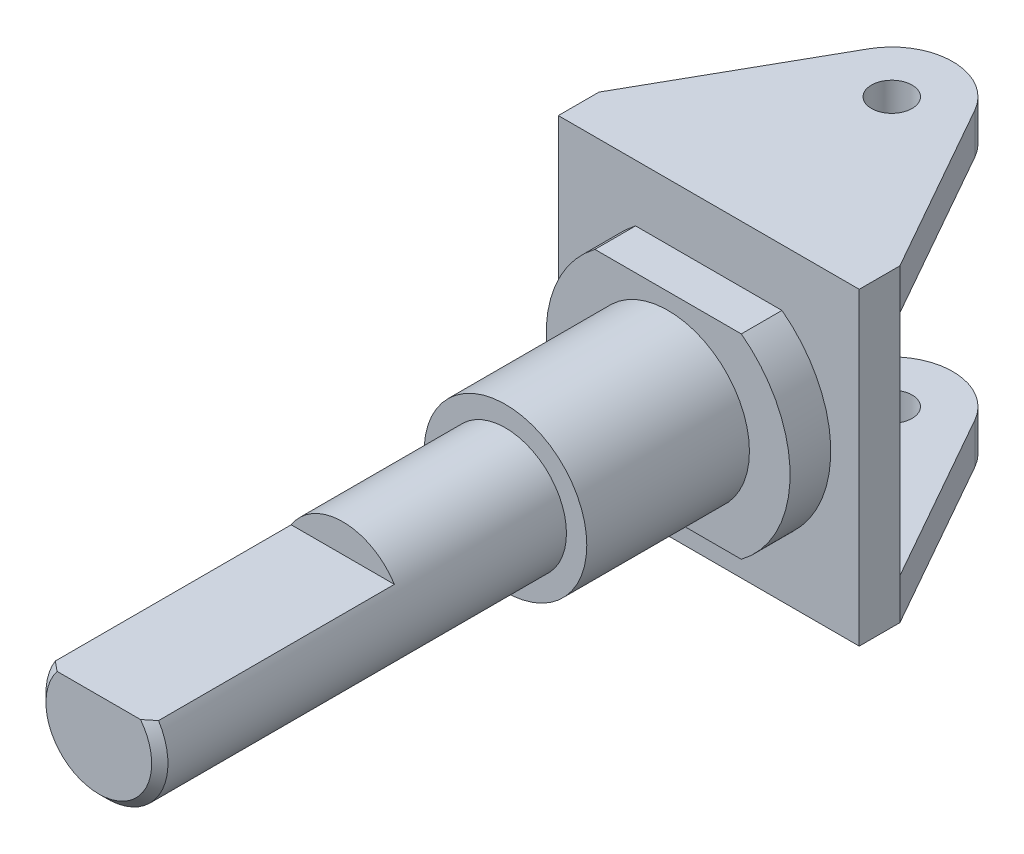
ISO-10303-21;
HEADER;
FILE_DESCRIPTION(('STEP AP214'),'2;1');
FILE_NAME('part.step','',(''),(''),'','','');
FILE_SCHEMA(('AUTOMOTIVE_DESIGN { 1 0 10303 214 1 1 1 1 }'));
ENDSEC;
DATA;
#1=APPLICATION_CONTEXT('core data for automotive mechanical design processes');
#2=APPLICATION_PROTOCOL_DEFINITION('international standard','automotive_design',2000,#1);
#3=PRODUCT_CONTEXT('',#1,'mechanical');
#4=PRODUCT('Part','Part','',(#3));
#5=PRODUCT_RELATED_PRODUCT_CATEGORY('part','',(#4));
#6=PRODUCT_DEFINITION_FORMATION('','',#4);
#7=PRODUCT_DEFINITION_CONTEXT('part definition',#1,'design');
#8=PRODUCT_DEFINITION('design','',#6,#7);
#9=PRODUCT_DEFINITION_SHAPE('','',#8);
#10=(LENGTH_UNIT() NAMED_UNIT(*) SI_UNIT(.MILLI.,.METRE.));
#11=(NAMED_UNIT(*) PLANE_ANGLE_UNIT() SI_UNIT($,.RADIAN.));
#12=(NAMED_UNIT(*) SI_UNIT($,.STERADIAN.) SOLID_ANGLE_UNIT());
#13=UNCERTAINTY_MEASURE_WITH_UNIT(LENGTH_MEASURE(1.E-05),#10,'distance_accuracy_value','');
#14=(GEOMETRIC_REPRESENTATION_CONTEXT(3) GLOBAL_UNCERTAINTY_ASSIGNED_CONTEXT((#13)) GLOBAL_UNIT_ASSIGNED_CONTEXT((#10,
#11,#12)) REPRESENTATION_CONTEXT('',''));
#15=CARTESIAN_POINT('',(0.,0.,0.));
#16=DIRECTION('',(0.,0.,1.));
#17=DIRECTION('',(1.,0.,0.));
#18=AXIS2_PLACEMENT_3D('',#15,#16,#17);
#19=CARTESIAN_POINT('',(0.,-38.,-45.));
#20=DIRECTION('',(0.,1.,0.));
#21=DIRECTION('',(0.,0.,1.));
#22=AXIS2_PLACEMENT_3D('',#19,#20,#21);
#23=PLANE('',#22);
#24=DIRECTION('',(0.,0.,-1.));
#25=VECTOR('',#24,1.);
#26=CARTESIAN_POINT('',(-37.,-38.,-10.));
#27=LINE('',#26,#25);
#28=CARTESIAN_POINT('',(-37.,-38.,0.));
#29=VERTEX_POINT('',#28);
#30=CARTESIAN_POINT('',(-37.,-38.,-10.));
#31=VERTEX_POINT('',#30);
#32=EDGE_CURVE('E252',#29,#31,#27,.T.);
#33=ORIENTED_EDGE('',*,*,#32,.T.);
#34=DIRECTION('',(0.491857302042566,0.,-0.870675826256482));
#35=VECTOR('',#34,1.);
#36=CARTESIAN_POINT('',(-13.0601373938472,-38.,-52.3778595306385));
#37=LINE('',#36,#35);
#38=CARTESIAN_POINT('',(-13.0601373938472,-38.,-52.3778595306385));
#39=VERTEX_POINT('',#38);
#40=EDGE_CURVE('E255',#31,#39,#37,.T.);
#41=ORIENTED_EDGE('',*,*,#40,.T.);
#42=CARTESIAN_POINT('',(0.,-38.,-45.));
#43=DIRECTION('',(0.,-1.,0.));
#44=DIRECTION('',(0.,0.,1.));
#45=AXIS2_PLACEMENT_3D('',#42,#43,#44);
#46=CIRCLE('',#45,15.);
#47=CARTESIAN_POINT('',(13.0601373938472,-38.,-52.3778595306385));
#48=VERTEX_POINT('',#47);
#49=EDGE_CURVE('E258',#39,#48,#46,.T.);
#50=ORIENTED_EDGE('',*,*,#49,.T.);
#51=DIRECTION('',(0.491857302042566,0.,0.870675826256482));
#52=VECTOR('',#51,1.);
#53=CARTESIAN_POINT('',(37.,-38.,-10.));
#54=LINE('',#53,#52);
#55=CARTESIAN_POINT('',(37.,-38.,-10.));
#56=VERTEX_POINT('',#55);
#57=EDGE_CURVE('E260',#48,#56,#54,.T.);
#58=ORIENTED_EDGE('',*,*,#57,.T.);
#59=DIRECTION('',(0.,0.,1.));
#60=VECTOR('',#59,1.);
#61=CARTESIAN_POINT('',(37.,-38.,0.));
#62=LINE('',#61,#60);
#63=CARTESIAN_POINT('',(37.,-38.,0.));
#64=VERTEX_POINT('',#63);
#65=EDGE_CURVE('E262',#56,#64,#62,.T.);
#66=ORIENTED_EDGE('',*,*,#65,.T.);
#67=DIRECTION('',(-1.,0.,0.));
#68=VECTOR('',#67,1.);
#69=CARTESIAN_POINT('',(-37.,-38.,0.));
#70=LINE('',#69,#68);
#71=EDGE_CURVE('E265',#64,#29,#70,.T.);
#72=ORIENTED_EDGE('',*,*,#71,.T.);
#73=EDGE_LOOP('',(#33,#41,#50,#58,#66,#72));
#74=FACE_BOUND('',#73,.T.);
#75=CARTESIAN_POINT('',(0.,-38.,-45.));
#76=DIRECTION('',(0.,-1.,0.));
#77=DIRECTION('',(0.,0.,-1.));
#78=AXIS2_PLACEMENT_3D('',#75,#76,#77);
#79=CIRCLE('',#78,4.99999999999999);
#80=CARTESIAN_POINT('',(0.,-38.,-50.));
#81=VERTEX_POINT('',#80);
#82=EDGE_CURVE('E438',#81,#81,#79,.T.);
#83=ORIENTED_EDGE('',*,*,#82,.F.);
#84=EDGE_LOOP('',(#83));
#85=FACE_BOUND('',#84,.T.);
#86=ADVANCED_FACE('F37',(#74,#85),#23,.F.);
#87=CARTESIAN_POINT('',(37.,-28.,-10.));
#88=DIRECTION('',(1.,0.,0.));
#89=DIRECTION('',(0.,0.,-1.));
#90=AXIS2_PLACEMENT_3D('',#87,#88,#89);
#91=PLANE('',#90);
#92=DIRECTION('',(0.,1.,0.));
#93=VECTOR('',#92,1.);
#94=CARTESIAN_POINT('',(37.,-28.,0.));
#95=LINE('',#94,#93);
#96=CARTESIAN_POINT('',(37.,38.,0.));
#97=VERTEX_POINT('',#96);
#98=EDGE_CURVE('E290',#64,#97,#95,.T.);
#99=ORIENTED_EDGE('',*,*,#98,.F.);
#100=ORIENTED_EDGE('',*,*,#65,.F.);
#101=DIRECTION('',(0.,1.,0.));
#102=VECTOR('',#101,1.);
#103=CARTESIAN_POINT('',(37.,-38.,-10.));
#104=LINE('',#103,#102);
#105=CARTESIAN_POINT('',(37.,-28.,-10.));
#106=VERTEX_POINT('',#105);
#107=EDGE_CURVE('E268',#56,#106,#104,.T.);
#108=ORIENTED_EDGE('',*,*,#107,.T.);
#109=DIRECTION('',(0.,1.,0.));
#110=VECTOR('',#109,1.);
#111=CARTESIAN_POINT('',(37.,-28.,-10.));
#112=LINE('',#111,#110);
#113=CARTESIAN_POINT('',(37.,28.,-10.));
#114=VERTEX_POINT('',#113);
#115=EDGE_CURVE('E184',#106,#114,#112,.T.);
#116=ORIENTED_EDGE('',*,*,#115,.T.);
#117=DIRECTION('',(0.,-1.,0.));
#118=VECTOR('',#117,1.);
#119=CARTESIAN_POINT('',(37.,38.,-10.));
#120=LINE('',#119,#118);
#121=CARTESIAN_POINT('',(37.,38.,-10.));
#122=VERTEX_POINT('',#121);
#123=EDGE_CURVE('E248',#122,#114,#120,.T.);
#124=ORIENTED_EDGE('',*,*,#123,.F.);
#125=DIRECTION('',(0.,0.,-1.));
#126=VECTOR('',#125,1.);
#127=CARTESIAN_POINT('',(37.,38.,-10.));
#128=LINE('',#127,#126);
#129=EDGE_CURVE('E218',#97,#122,#128,.T.);
#130=ORIENTED_EDGE('',*,*,#129,.F.);
#131=EDGE_LOOP('',(#99,#100,#108,#116,#124,#130));
#132=FACE_BOUND('',#131,.T.);
#133=ADVANCED_FACE('F375',(#132),#91,.T.);
#134=CARTESIAN_POINT('',(-37.,28.,-10.));
#135=DIRECTION('',(-1.,0.,0.));
#136=DIRECTION('',(0.,0.,1.));
#137=AXIS2_PLACEMENT_3D('',#134,#135,#136);
#138=PLANE('',#137);
#139=DIRECTION('',(0.,-1.,0.));
#140=VECTOR('',#139,1.);
#141=CARTESIAN_POINT('',(-37.,28.,0.));
#142=LINE('',#141,#140);
#143=CARTESIAN_POINT('',(-37.,38.,0.));
#144=VERTEX_POINT('',#143);
#145=EDGE_CURVE('E285',#144,#29,#142,.T.);
#146=ORIENTED_EDGE('',*,*,#145,.F.);
#147=DIRECTION('',(0.,0.,1.));
#148=VECTOR('',#147,1.);
#149=CARTESIAN_POINT('',(-37.,38.,0.));
#150=LINE('',#149,#148);
#151=CARTESIAN_POINT('',(-37.,38.,-10.));
#152=VERTEX_POINT('',#151);
#153=EDGE_CURVE('E228',#152,#144,#150,.T.);
#154=ORIENTED_EDGE('',*,*,#153,.F.);
#155=DIRECTION('',(0.,-1.,0.));
#156=VECTOR('',#155,1.);
#157=CARTESIAN_POINT('',(-37.,38.,-10.));
#158=LINE('',#157,#156);
#159=CARTESIAN_POINT('',(-37.,28.,-10.));
#160=VERTEX_POINT('',#159);
#161=EDGE_CURVE('E234',#152,#160,#158,.T.);
#162=ORIENTED_EDGE('',*,*,#161,.T.);
#163=DIRECTION('',(0.,-1.,0.));
#164=VECTOR('',#163,1.);
#165=CARTESIAN_POINT('',(-37.,28.,-10.));
#166=LINE('',#165,#164);
#167=CARTESIAN_POINT('',(-37.,-28.,-10.));
#168=VERTEX_POINT('',#167);
#169=EDGE_CURVE('E289',#160,#168,#166,.T.);
#170=ORIENTED_EDGE('',*,*,#169,.T.);
#171=DIRECTION('',(0.,1.,0.));
#172=VECTOR('',#171,1.);
#173=CARTESIAN_POINT('',(-37.,-38.,-10.));
#174=LINE('',#173,#172);
#175=EDGE_CURVE('E282',#31,#168,#174,.T.);
#176=ORIENTED_EDGE('',*,*,#175,.F.);
#177=ORIENTED_EDGE('',*,*,#32,.F.);
#178=EDGE_LOOP('',(#146,#154,#162,#170,#176,#177));
#179=FACE_BOUND('',#178,.T.);
#180=ADVANCED_FACE('F396',(#179),#138,.T.);
#181=CARTESIAN_POINT('',(0.,0.,-10.));
#182=DIRECTION('',(0.,0.,1.));
#183=DIRECTION('',(1.,0.,0.));
#184=AXIS2_PLACEMENT_3D('',#181,#182,#183);
#185=PLANE('',#184);
#186=DIRECTION('',(-1.,0.,0.));
#187=VECTOR('',#186,1.);
#188=CARTESIAN_POINT('',(37.,28.,-10.));
#189=LINE('',#188,#187);
#190=EDGE_CURVE('E286',#114,#160,#189,.T.);
#191=ORIENTED_EDGE('',*,*,#190,.F.);
#192=ORIENTED_EDGE('',*,*,#115,.F.);
#193=DIRECTION('',(1.,0.,0.));
#194=VECTOR('',#193,1.);
#195=CARTESIAN_POINT('',(-37.,-28.,-10.));
#196=LINE('',#195,#194);
#197=EDGE_CURVE('E293',#168,#106,#196,.T.);
#198=ORIENTED_EDGE('',*,*,#197,.F.);
#199=ORIENTED_EDGE('',*,*,#169,.F.);
#200=EDGE_LOOP('',(#191,#192,#198,#199));
#201=FACE_BOUND('',#200,.T.);
#202=ADVANCED_FACE('F393',(#201),#185,.F.);
#203=CARTESIAN_POINT('',(0.,0.,0.));
#204=DIRECTION('',(0.,0.,1.));
#205=DIRECTION('',(1.,0.,0.));
#206=AXIS2_PLACEMENT_3D('',#203,#204,#205);
#207=PLANE('',#206);
#208=CARTESIAN_POINT('',(0.,0.,0.));
#209=DIRECTION('',(0.,0.,1.));
#210=DIRECTION('',(-1.,0.,0.));
#211=AXIS2_PLACEMENT_3D('',#208,#209,#210);
#212=CIRCLE('',#211,30.);
#213=CARTESIAN_POINT('',(18.,-24.,0.));
#214=VERTEX_POINT('',#213);
#215=CARTESIAN_POINT('',(18.,24.,0.));
#216=VERTEX_POINT('',#215);
#217=EDGE_CURVE('E181',#214,#216,#212,.T.);
#218=ORIENTED_EDGE('',*,*,#217,.F.);
#219=DIRECTION('',(1.,0.,0.));
#220=VECTOR('',#219,1.);
#221=CARTESIAN_POINT('',(18.,-24.,0.));
#222=LINE('',#221,#220);
#223=CARTESIAN_POINT('',(-18.,-24.,0.));
#224=VERTEX_POINT('',#223);
#225=EDGE_CURVE('E189',#224,#214,#222,.T.);
#226=ORIENTED_EDGE('',*,*,#225,.F.);
#227=CARTESIAN_POINT('',(0.,0.,0.));
#228=DIRECTION('',(0.,0.,1.));
#229=DIRECTION('',(-1.,0.,0.));
#230=AXIS2_PLACEMENT_3D('',#227,#228,#229);
#231=CIRCLE('',#230,30.);
#232=CARTESIAN_POINT('',(-18.,24.,0.));
#233=VERTEX_POINT('',#232);
#234=EDGE_CURVE('E201',#233,#224,#231,.T.);
#235=ORIENTED_EDGE('',*,*,#234,.F.);
#236=DIRECTION('',(-1.,0.,0.));
#237=VECTOR('',#236,1.);
#238=CARTESIAN_POINT('',(-18.,24.,0.));
#239=LINE('',#238,#237);
#240=EDGE_CURVE('E198',#216,#233,#239,.T.);
#241=ORIENTED_EDGE('',*,*,#240,.F.);
#242=EDGE_LOOP('',(#218,#226,#235,#241));
#243=FACE_BOUND('',#242,.T.);
#244=ORIENTED_EDGE('',*,*,#98,.T.);
#245=DIRECTION('',(1.,0.,0.));
#246=VECTOR('',#245,1.);
#247=CARTESIAN_POINT('',(37.,38.,0.));
#248=LINE('',#247,#246);
#249=EDGE_CURVE('E231',#144,#97,#248,.T.);
#250=ORIENTED_EDGE('',*,*,#249,.F.);
#251=ORIENTED_EDGE('',*,*,#145,.T.);
#252=ORIENTED_EDGE('',*,*,#71,.F.);
#253=EDGE_LOOP('',(#244,#250,#251,#252));
#254=FACE_BOUND('',#253,.T.);
#255=ADVANCED_FACE('F391',(#243,#254),#207,.T.);
#256=CARTESIAN_POINT('',(-13.0601373938472,-38.,-52.3778595306385));
#257=DIRECTION('',(0.870675826256482,0.,0.491857302042566));
#258=DIRECTION('',(0.491857302042566,0.,-0.870675826256482));
#259=AXIS2_PLACEMENT_3D('',#256,#257,#258);
#260=PLANE('',#259);
#261=DIRECTION('',(0.491857302042566,0.,-0.870675826256482));
#262=VECTOR('',#261,1.);
#263=CARTESIAN_POINT('',(-13.0601373938472,-28.,-52.3778595306385));
#264=LINE('',#263,#262);
#265=CARTESIAN_POINT('',(-13.0601373938472,-28.,-52.3778595306385));
#266=VERTEX_POINT('',#265);
#267=EDGE_CURVE('E251',#168,#266,#264,.T.);
#268=ORIENTED_EDGE('',*,*,#267,.T.);
#269=DIRECTION('',(0.,1.,0.));
#270=VECTOR('',#269,1.);
#271=CARTESIAN_POINT('',(-13.0601373938472,-38.,-52.3778595306385));
#272=LINE('',#271,#270);
#273=EDGE_CURVE('E279',#39,#266,#272,.T.);
#274=ORIENTED_EDGE('',*,*,#273,.F.);
#275=ORIENTED_EDGE('',*,*,#40,.F.);
#276=ORIENTED_EDGE('',*,*,#175,.T.);
#277=EDGE_LOOP('',(#268,#274,#275,#276));
#278=FACE_BOUND('',#277,.T.);
#279=ADVANCED_FACE('F387',(#278),#260,.F.);
#280=CARTESIAN_POINT('',(0.,-38.,-45.));
#281=DIRECTION('',(0.,1.,0.));
#282=DIRECTION('',(0.,0.,1.));
#283=AXIS2_PLACEMENT_3D('',#280,#281,#282);
#284=CYLINDRICAL_SURFACE('',#283,15.);
#285=CARTESIAN_POINT('',(0.,-28.,-45.));
#286=DIRECTION('',(0.,-1.,0.));
#287=DIRECTION('',(0.,0.,1.));
#288=AXIS2_PLACEMENT_3D('',#285,#286,#287);
#289=CIRCLE('',#288,15.);
#290=CARTESIAN_POINT('',(13.0601373938472,-28.,-52.3778595306385));
#291=VERTEX_POINT('',#290);
#292=EDGE_CURVE('E270',#266,#291,#289,.T.);
#293=ORIENTED_EDGE('',*,*,#292,.T.);
#294=DIRECTION('',(0.,1.,0.));
#295=VECTOR('',#294,1.);
#296=CARTESIAN_POINT('',(13.0601373938472,-38.,-52.3778595306385));
#297=LINE('',#296,#295);
#298=EDGE_CURVE('E276',#48,#291,#297,.T.);
#299=ORIENTED_EDGE('',*,*,#298,.F.);
#300=ORIENTED_EDGE('',*,*,#49,.F.);
#301=ORIENTED_EDGE('',*,*,#273,.T.);
#302=EDGE_LOOP('',(#293,#299,#300,#301));
#303=FACE_BOUND('',#302,.T.);
#304=ADVANCED_FACE('F383',(#303),#284,.T.);
#305=CARTESIAN_POINT('',(37.,-38.,-10.));
#306=DIRECTION('',(-0.870675826256482,0.,0.491857302042566));
#307=DIRECTION('',(0.491857302042566,0.,0.870675826256482));
#308=AXIS2_PLACEMENT_3D('',#305,#306,#307);
#309=PLANE('',#308);
#310=DIRECTION('',(0.491857302042566,0.,0.870675826256482));
#311=VECTOR('',#310,1.);
#312=CARTESIAN_POINT('',(37.,-28.,-10.));
#313=LINE('',#312,#311);
#314=EDGE_CURVE('E256',#291,#106,#313,.T.);
#315=ORIENTED_EDGE('',*,*,#314,.T.);
#316=ORIENTED_EDGE('',*,*,#107,.F.);
#317=ORIENTED_EDGE('',*,*,#57,.F.);
#318=ORIENTED_EDGE('',*,*,#298,.T.);
#319=EDGE_LOOP('',(#315,#316,#317,#318));
#320=FACE_BOUND('',#319,.T.);
#321=ADVANCED_FACE('F379',(#320),#309,.F.);
#322=CARTESIAN_POINT('',(0.,-28.,-45.));
#323=DIRECTION('',(0.,1.,0.));
#324=DIRECTION('',(0.,0.,1.));
#325=AXIS2_PLACEMENT_3D('',#322,#323,#324);
#326=PLANE('',#325);
#327=CARTESIAN_POINT('',(0.,-28.,-45.));
#328=DIRECTION('',(0.,1.,0.));
#329=DIRECTION('',(0.,0.,1.));
#330=AXIS2_PLACEMENT_3D('',#327,#328,#329);
#331=CIRCLE('',#330,4.99999999999999);
#332=CARTESIAN_POINT('',(0.,-28.,-40.));
#333=VERTEX_POINT('',#332);
#334=EDGE_CURVE('E440',#333,#333,#331,.T.);
#335=ORIENTED_EDGE('',*,*,#334,.F.);
#336=EDGE_LOOP('',(#335));
#337=FACE_BOUND('',#336,.T.);
#338=ORIENTED_EDGE('',*,*,#267,.F.);
#339=ORIENTED_EDGE('',*,*,#197,.T.);
#340=ORIENTED_EDGE('',*,*,#314,.F.);
#341=ORIENTED_EDGE('',*,*,#292,.F.);
#342=EDGE_LOOP('',(#338,#339,#340,#341));
#343=FACE_BOUND('',#342,.T.);
#344=ADVANCED_FACE('F371',(#337,#343),#326,.T.);
#345=CARTESIAN_POINT('',(13.0601373938472,38.,-52.3778595306385));
#346=DIRECTION('',(-0.870675826256482,0.,0.491857302042566));
#347=DIRECTION('',(0.491857302042566,0.,0.870675826256482));
#348=AXIS2_PLACEMENT_3D('',#345,#346,#347);
#349=PLANE('',#348);
#350=DIRECTION('',(-0.491857302042566,0.,-0.870675826256482));
#351=VECTOR('',#350,1.);
#352=CARTESIAN_POINT('',(13.0601373938472,28.,-52.3778595306385));
#353=LINE('',#352,#351);
#354=CARTESIAN_POINT('',(13.0601373938472,28.,-52.3778595306385));
#355=VERTEX_POINT('',#354);
#356=EDGE_CURVE('E217',#114,#355,#353,.T.);
#357=ORIENTED_EDGE('',*,*,#356,.T.);
#358=DIRECTION('',(0.,-1.,0.));
#359=VECTOR('',#358,1.);
#360=CARTESIAN_POINT('',(13.0601373938472,38.,-52.3778595306385));
#361=LINE('',#360,#359);
#362=CARTESIAN_POINT('',(13.0601373938472,38.,-52.3778595306385));
#363=VERTEX_POINT('',#362);
#364=EDGE_CURVE('E245',#363,#355,#361,.T.);
#365=ORIENTED_EDGE('',*,*,#364,.F.);
#366=DIRECTION('',(-0.491857302042566,0.,-0.870675826256482));
#367=VECTOR('',#366,1.);
#368=CARTESIAN_POINT('',(13.0601373938472,38.,-52.3778595306385));
#369=LINE('',#368,#367);
#370=EDGE_CURVE('E221',#122,#363,#369,.T.);
#371=ORIENTED_EDGE('',*,*,#370,.F.);
#372=ORIENTED_EDGE('',*,*,#123,.T.);
#373=EDGE_LOOP('',(#357,#365,#371,#372));
#374=FACE_BOUND('',#373,.T.);
#375=ADVANCED_FACE('F367',(#374),#349,.F.);
#376=CARTESIAN_POINT('',(0.,38.,-45.));
#377=DIRECTION('',(0.,-1.,0.));
#378=DIRECTION('',(0.,0.,-1.));
#379=AXIS2_PLACEMENT_3D('',#376,#377,#378);
#380=CYLINDRICAL_SURFACE('',#379,15.);
#381=CARTESIAN_POINT('',(0.,28.,-45.));
#382=DIRECTION('',(0.,1.,0.));
#383=DIRECTION('',(0.,0.,-1.));
#384=AXIS2_PLACEMENT_3D('',#381,#382,#383);
#385=CIRCLE('',#384,15.);
#386=CARTESIAN_POINT('',(-13.0601373938472,28.,-52.3778595306385));
#387=VERTEX_POINT('',#386);
#388=EDGE_CURVE('E236',#355,#387,#385,.T.);
#389=ORIENTED_EDGE('',*,*,#388,.T.);
#390=DIRECTION('',(0.,-1.,0.));
#391=VECTOR('',#390,1.);
#392=CARTESIAN_POINT('',(-13.0601373938472,38.,-52.3778595306385));
#393=LINE('',#392,#391);
#394=CARTESIAN_POINT('',(-13.0601373938472,38.,-52.3778595306385));
#395=VERTEX_POINT('',#394);
#396=EDGE_CURVE('E242',#395,#387,#393,.T.);
#397=ORIENTED_EDGE('',*,*,#396,.F.);
#398=CARTESIAN_POINT('',(0.,38.,-45.));
#399=DIRECTION('',(0.,1.,0.));
#400=DIRECTION('',(0.,0.,-1.));
#401=AXIS2_PLACEMENT_3D('',#398,#399,#400);
#402=CIRCLE('',#401,15.);
#403=EDGE_CURVE('E224',#363,#395,#402,.T.);
#404=ORIENTED_EDGE('',*,*,#403,.F.);
#405=ORIENTED_EDGE('',*,*,#364,.T.);
#406=EDGE_LOOP('',(#389,#397,#404,#405));
#407=FACE_BOUND('',#406,.T.);
#408=ADVANCED_FACE('F363',(#407),#380,.T.);
#409=CARTESIAN_POINT('',(-37.,38.,-10.));
#410=DIRECTION('',(0.870675826256482,0.,0.491857302042566));
#411=DIRECTION('',(0.491857302042566,0.,-0.870675826256482));
#412=AXIS2_PLACEMENT_3D('',#409,#410,#411);
#413=PLANE('',#412);
#414=DIRECTION('',(-0.491857302042566,0.,0.870675826256482));
#415=VECTOR('',#414,1.);
#416=CARTESIAN_POINT('',(-37.,28.,-10.));
#417=LINE('',#416,#415);
#418=EDGE_CURVE('E222',#387,#160,#417,.T.);
#419=ORIENTED_EDGE('',*,*,#418,.T.);
#420=ORIENTED_EDGE('',*,*,#161,.F.);
#421=DIRECTION('',(-0.491857302042566,0.,0.870675826256482));
#422=VECTOR('',#421,1.);
#423=CARTESIAN_POINT('',(-37.,38.,-10.));
#424=LINE('',#423,#422);
#425=EDGE_CURVE('E226',#395,#152,#424,.T.);
#426=ORIENTED_EDGE('',*,*,#425,.F.);
#427=ORIENTED_EDGE('',*,*,#396,.T.);
#428=EDGE_LOOP('',(#419,#420,#426,#427));
#429=FACE_BOUND('',#428,.T.);
#430=ADVANCED_FACE('F356',(#429),#413,.F.);
#431=CARTESIAN_POINT('',(0.,38.,-45.));
#432=DIRECTION('',(0.,-1.,0.));
#433=DIRECTION('',(0.,0.,-1.));
#434=AXIS2_PLACEMENT_3D('',#431,#432,#433);
#435=PLANE('',#434);
#436=CARTESIAN_POINT('',(0.,38.,-45.));
#437=DIRECTION('',(0.,1.,0.));
#438=DIRECTION('',(0.,0.,1.));
#439=AXIS2_PLACEMENT_3D('',#436,#437,#438);
#440=CIRCLE('',#439,4.99999999999999);
#441=CARTESIAN_POINT('',(0.,38.,-40.));
#442=VERTEX_POINT('',#441);
#443=EDGE_CURVE('E446',#442,#442,#440,.T.);
#444=ORIENTED_EDGE('',*,*,#443,.F.);
#445=EDGE_LOOP('',(#444));
#446=FACE_BOUND('',#445,.T.);
#447=ORIENTED_EDGE('',*,*,#129,.T.);
#448=ORIENTED_EDGE('',*,*,#370,.T.);
#449=ORIENTED_EDGE('',*,*,#403,.T.);
#450=ORIENTED_EDGE('',*,*,#425,.T.);
#451=ORIENTED_EDGE('',*,*,#153,.T.);
#452=ORIENTED_EDGE('',*,*,#249,.T.);
#453=EDGE_LOOP('',(#447,#448,#449,#450,#451,#452));
#454=FACE_BOUND('',#453,.T.);
#455=ADVANCED_FACE('F353',(#446,#454),#435,.F.);
#456=CARTESIAN_POINT('',(0.,28.,-45.));
#457=DIRECTION('',(0.,-1.,0.));
#458=DIRECTION('',(0.,0.,-1.));
#459=AXIS2_PLACEMENT_3D('',#456,#457,#458);
#460=PLANE('',#459);
#461=CARTESIAN_POINT('',(0.,28.,-45.));
#462=DIRECTION('',(0.,-1.,0.));
#463=DIRECTION('',(0.,0.,-1.));
#464=AXIS2_PLACEMENT_3D('',#461,#462,#463);
#465=CIRCLE('',#464,4.99999999999998);
#466=CARTESIAN_POINT('',(0.,28.,-50.));
#467=VERTEX_POINT('',#466);
#468=EDGE_CURVE('E441',#467,#467,#465,.T.);
#469=ORIENTED_EDGE('',*,*,#468,.F.);
#470=EDGE_LOOP('',(#469));
#471=FACE_BOUND('',#470,.T.);
#472=ORIENTED_EDGE('',*,*,#356,.F.);
#473=ORIENTED_EDGE('',*,*,#190,.T.);
#474=ORIENTED_EDGE('',*,*,#418,.F.);
#475=ORIENTED_EDGE('',*,*,#388,.F.);
#476=EDGE_LOOP('',(#472,#473,#474,#475));
#477=FACE_BOUND('',#476,.T.);
#478=ADVANCED_FACE('F351',(#471,#477),#460,.T.);
#479=CARTESIAN_POINT('',(0.,0.,10.));
#480=DIRECTION('',(0.,0.,-1.));
#481=DIRECTION('',(-1.,0.,0.));
#482=AXIS2_PLACEMENT_3D('',#479,#480,#481);
#483=CYLINDRICAL_SURFACE('',#482,30.);
#484=ORIENTED_EDGE('',*,*,#217,.T.);
#485=DIRECTION('',(0.,0.,-1.));
#486=VECTOR('',#485,1.);
#487=CARTESIAN_POINT('',(18.,24.,10.));
#488=LINE('',#487,#486);
#489=CARTESIAN_POINT('',(18.,24.,10.));
#490=VERTEX_POINT('',#489);
#491=EDGE_CURVE('E214',#490,#216,#488,.T.);
#492=ORIENTED_EDGE('',*,*,#491,.F.);
#493=CARTESIAN_POINT('',(0.,0.,10.));
#494=DIRECTION('',(0.,0.,1.));
#495=DIRECTION('',(-1.,0.,0.));
#496=AXIS2_PLACEMENT_3D('',#493,#494,#495);
#497=CIRCLE('',#496,30.);
#498=CARTESIAN_POINT('',(18.,-24.,10.));
#499=VERTEX_POINT('',#498);
#500=EDGE_CURVE('E185',#499,#490,#497,.T.);
#501=ORIENTED_EDGE('',*,*,#500,.F.);
#502=DIRECTION('',(0.,0.,-1.));
#503=VECTOR('',#502,1.);
#504=CARTESIAN_POINT('',(18.,-24.,10.));
#505=LINE('',#504,#503);
#506=EDGE_CURVE('E195',#499,#214,#505,.T.);
#507=ORIENTED_EDGE('',*,*,#506,.T.);
#508=EDGE_LOOP('',(#484,#492,#501,#507));
#509=FACE_BOUND('',#508,.T.);
#510=ADVANCED_FACE('F347',(#509),#483,.T.);
#511=CARTESIAN_POINT('',(-18.,24.,10.));
#512=DIRECTION('',(0.,-1.,0.));
#513=DIRECTION('',(0.,0.,-1.));
#514=AXIS2_PLACEMENT_3D('',#511,#512,#513);
#515=PLANE('',#514);
#516=ORIENTED_EDGE('',*,*,#240,.T.);
#517=DIRECTION('',(0.,0.,-1.));
#518=VECTOR('',#517,1.);
#519=CARTESIAN_POINT('',(-18.,24.,10.));
#520=LINE('',#519,#518);
#521=CARTESIAN_POINT('',(-18.,24.,10.));
#522=VERTEX_POINT('',#521);
#523=EDGE_CURVE('E211',#522,#233,#520,.T.);
#524=ORIENTED_EDGE('',*,*,#523,.F.);
#525=DIRECTION('',(-1.,0.,0.));
#526=VECTOR('',#525,1.);
#527=CARTESIAN_POINT('',(-18.,24.,10.));
#528=LINE('',#527,#526);
#529=EDGE_CURVE('E188',#490,#522,#528,.T.);
#530=ORIENTED_EDGE('',*,*,#529,.F.);
#531=ORIENTED_EDGE('',*,*,#491,.T.);
#532=EDGE_LOOP('',(#516,#524,#530,#531));
#533=FACE_BOUND('',#532,.T.);
#534=ADVANCED_FACE('F343',(#533),#515,.F.);
#535=CARTESIAN_POINT('',(0.,0.,10.));
#536=DIRECTION('',(0.,0.,-1.));
#537=DIRECTION('',(-1.,0.,0.));
#538=AXIS2_PLACEMENT_3D('',#535,#536,#537);
#539=CYLINDRICAL_SURFACE('',#538,30.);
#540=ORIENTED_EDGE('',*,*,#234,.T.);
#541=DIRECTION('',(0.,0.,-1.));
#542=VECTOR('',#541,1.);
#543=CARTESIAN_POINT('',(-18.,-24.,10.));
#544=LINE('',#543,#542);
#545=CARTESIAN_POINT('',(-18.,-24.,10.));
#546=VERTEX_POINT('',#545);
#547=EDGE_CURVE('E208',#546,#224,#544,.T.);
#548=ORIENTED_EDGE('',*,*,#547,.F.);
#549=CARTESIAN_POINT('',(0.,0.,10.));
#550=DIRECTION('',(0.,0.,1.));
#551=DIRECTION('',(-1.,0.,0.));
#552=AXIS2_PLACEMENT_3D('',#549,#550,#551);
#553=CIRCLE('',#552,30.);
#554=EDGE_CURVE('E191',#522,#546,#553,.T.);
#555=ORIENTED_EDGE('',*,*,#554,.F.);
#556=ORIENTED_EDGE('',*,*,#523,.T.);
#557=EDGE_LOOP('',(#540,#548,#555,#556));
#558=FACE_BOUND('',#557,.T.);
#559=ADVANCED_FACE('F339',(#558),#539,.T.);
#560=CARTESIAN_POINT('',(18.,-24.,10.));
#561=DIRECTION('',(0.,1.,0.));
#562=DIRECTION('',(0.,0.,1.));
#563=AXIS2_PLACEMENT_3D('',#560,#561,#562);
#564=PLANE('',#563);
#565=ORIENTED_EDGE('',*,*,#225,.T.);
#566=ORIENTED_EDGE('',*,*,#506,.F.);
#567=DIRECTION('',(1.,0.,0.));
#568=VECTOR('',#567,1.);
#569=CARTESIAN_POINT('',(18.,-24.,10.));
#570=LINE('',#569,#568);
#571=EDGE_CURVE('E193',#546,#499,#570,.T.);
#572=ORIENTED_EDGE('',*,*,#571,.F.);
#573=ORIENTED_EDGE('',*,*,#547,.T.);
#574=EDGE_LOOP('',(#565,#566,#572,#573));
#575=FACE_BOUND('',#574,.T.);
#576=ADVANCED_FACE('F335',(#575),#564,.F.);
#577=CARTESIAN_POINT('',(0.,0.,10.));
#578=DIRECTION('',(0.,0.,-1.));
#579=DIRECTION('',(-1.,0.,0.));
#580=AXIS2_PLACEMENT_3D('',#577,#578,#579);
#581=PLANE('',#580);
#582=CARTESIAN_POINT('',(0.,0.,10.));
#583=DIRECTION('',(0.,0.,1.));
#584=DIRECTION('',(1.,0.,0.));
#585=AXIS2_PLACEMENT_3D('',#582,#583,#584);
#586=CIRCLE('',#585,20.);
#587=CARTESIAN_POINT('',(20.,0.,10.));
#588=VERTEX_POINT('',#587);
#589=EDGE_CURVE('E178',#588,#588,#586,.T.);
#590=ORIENTED_EDGE('',*,*,#589,.F.);
#591=EDGE_LOOP('',(#590));
#592=FACE_BOUND('',#591,.T.);
#593=ORIENTED_EDGE('',*,*,#500,.T.);
#594=ORIENTED_EDGE('',*,*,#529,.T.);
#595=ORIENTED_EDGE('',*,*,#554,.T.);
#596=ORIENTED_EDGE('',*,*,#571,.T.);
#597=EDGE_LOOP('',(#593,#594,#595,#596));
#598=FACE_BOUND('',#597,.T.);
#599=ADVANCED_FACE('F331',(#592,#598),#581,.F.);
#600=CARTESIAN_POINT('',(0.,0.,50.));
#601=DIRECTION('',(0.,0.,-1.));
#602=DIRECTION('',(-1.,0.,0.));
#603=AXIS2_PLACEMENT_3D('',#600,#601,#602);
#604=CYLINDRICAL_SURFACE('',#603,20.);
#605=CARTESIAN_POINT('',(0.,0.,50.));
#606=DIRECTION('',(0.,0.,1.));
#607=DIRECTION('',(1.,0.,0.));
#608=AXIS2_PLACEMENT_3D('',#605,#606,#607);
#609=CIRCLE('',#608,20.);
#610=CARTESIAN_POINT('',(20.,0.,50.));
#611=VERTEX_POINT('',#610);
#612=EDGE_CURVE('E170',#611,#611,#609,.T.);
#613=ORIENTED_EDGE('',*,*,#612,.F.);
#614=EDGE_LOOP('',(#613));
#615=FACE_BOUND('',#614,.T.);
#616=ORIENTED_EDGE('',*,*,#589,.T.);
#617=EDGE_LOOP('',(#616));
#618=FACE_BOUND('',#617,.T.);
#619=ADVANCED_FACE('F327',(#615,#618),#604,.T.);
#620=CARTESIAN_POINT('',(0.,0.,50.));
#621=DIRECTION('',(0.,0.,1.));
#622=DIRECTION('',(1.,0.,0.));
#623=AXIS2_PLACEMENT_3D('',#620,#621,#622);
#624=PLANE('',#623);
#625=CARTESIAN_POINT('',(0.,0.,50.));
#626=DIRECTION('',(0.,0.,1.));
#627=DIRECTION('',(1.,0.,0.));
#628=AXIS2_PLACEMENT_3D('',#625,#626,#627);
#629=CIRCLE('',#628,15.);
#630=CARTESIAN_POINT('',(15.,0.,50.));
#631=VERTEX_POINT('',#630);
#632=EDGE_CURVE('E174',#631,#631,#629,.T.);
#633=ORIENTED_EDGE('',*,*,#632,.F.);
#634=EDGE_LOOP('',(#633));
#635=FACE_BOUND('',#634,.T.);
#636=ORIENTED_EDGE('',*,*,#612,.T.);
#637=EDGE_LOOP('',(#636));
#638=FACE_BOUND('',#637,.T.);
#639=ADVANCED_FACE('F324',(#635,#638),#624,.T.);
#640=CARTESIAN_POINT('',(0.,0.,150.));
#641=DIRECTION('',(0.,0.,-1.));
#642=DIRECTION('',(-1.,0.,0.));
#643=AXIS2_PLACEMENT_3D('',#640,#641,#642);
#644=CYLINDRICAL_SURFACE('',#643,15.);
#645=DIRECTION('',(0.,0.,1.));
#646=VECTOR('',#645,1.);
#647=CARTESIAN_POINT('',(12.6885775404495,8.,90.));
#648=LINE('',#647,#646);
#649=CARTESIAN_POINT('',(12.6885775404495,8.,90.));
#650=VERTEX_POINT('',#649);
#651=CARTESIAN_POINT('',(12.6885775404495,8.,148.));
#652=VERTEX_POINT('',#651);
#653=EDGE_CURVE('E165',#650,#652,#648,.T.);
#654=ORIENTED_EDGE('',*,*,#653,.T.);
#655=CARTESIAN_POINT('',(0.,0.,148.));
#656=DIRECTION('',(0.,0.,1.));
#657=DIRECTION('',(1.,0.,0.));
#658=AXIS2_PLACEMENT_3D('',#655,#656,#657);
#659=CIRCLE('',#658,15.);
#660=CARTESIAN_POINT('',(-12.6885775404495,8.,148.));
#661=VERTEX_POINT('',#660);
#662=EDGE_CURVE('E11',#652,#661,#659,.F.);
#663=ORIENTED_EDGE('',*,*,#662,.T.);
#664=DIRECTION('',(0.,0.,1.));
#665=VECTOR('',#664,1.);
#666=CARTESIAN_POINT('',(-12.6885775404495,8.,90.));
#667=LINE('',#666,#665);
#668=CARTESIAN_POINT('',(-12.6885775404495,8.,90.));
#669=VERTEX_POINT('',#668);
#670=EDGE_CURVE('E163',#669,#661,#667,.T.);
#671=ORIENTED_EDGE('',*,*,#670,.F.);
#672=CARTESIAN_POINT('',(0.,0.,90.));
#673=DIRECTION('',(0.,0.,1.));
#674=DIRECTION('',(1.,0.,0.));
#675=AXIS2_PLACEMENT_3D('',#672,#673,#674);
#676=CIRCLE('',#675,15.);
#677=EDGE_CURVE('E156',#650,#669,#676,.T.);
#678=ORIENTED_EDGE('',*,*,#677,.F.);
#679=EDGE_LOOP('',(#654,#663,#671,#678));
#680=FACE_BOUND('',#679,.T.);
#681=ORIENTED_EDGE('',*,*,#632,.T.);
#682=EDGE_LOOP('',(#681));
#683=FACE_BOUND('',#682,.T.);
#684=ADVANCED_FACE('F167',(#680,#683),#644,.T.);
#685=CARTESIAN_POINT('',(0.,0.,150.));
#686=DIRECTION('',(0.,0.,1.));
#687=DIRECTION('',(1.,0.,0.));
#688=AXIS2_PLACEMENT_3D('',#685,#686,#687);
#689=PLANE('',#688);
#690=DIRECTION('',(1.,0.,0.));
#691=VECTOR('',#690,1.);
#692=CARTESIAN_POINT('',(-12.6885775404495,8.,150.));
#693=LINE('',#692,#691);
#694=CARTESIAN_POINT('',(-10.2469507659598,8.,150.));
#695=VERTEX_POINT('',#694);
#696=CARTESIAN_POINT('',(10.2469507659598,8.,150.));
#697=VERTEX_POINT('',#696);
#698=EDGE_CURVE('E160',#695,#697,#693,.T.);
#699=ORIENTED_EDGE('',*,*,#698,.F.);
#700=CARTESIAN_POINT('',(0.,0.,150.));
#701=DIRECTION('',(0.,0.,1.));
#702=DIRECTION('',(1.,0.,0.));
#703=AXIS2_PLACEMENT_3D('',#700,#701,#702);
#704=CIRCLE('',#703,13.0000000000001);
#705=EDGE_CURVE('E177',#695,#697,#704,.T.);
#706=ORIENTED_EDGE('',*,*,#705,.T.);
#707=EDGE_LOOP('',(#699,#706));
#708=FACE_BOUND('',#707,.T.);
#709=ADVANCED_FACE('F316',(#708),#689,.T.);
#710=CARTESIAN_POINT('',(-12.6885775404495,8.,90.));
#711=DIRECTION('',(0.,-1.,0.));
#712=DIRECTION('',(0.,0.,-1.));
#713=AXIS2_PLACEMENT_3D('',#710,#711,#712);
#714=PLANE('',#713);
#715=ORIENTED_EDGE('',*,*,#698,.T.);
#716=CARTESIAN_POINT('',(10.2469507659598,8.,150.));
#717=CARTESIAN_POINT('',(10.4535274279111,8.,149.837157689493));
#718=CARTESIAN_POINT('',(10.6592075116509,8.,149.673183678239));
#719=CARTESIAN_POINT('',(11.0689468639801,8.,149.343252945693));
#720=CARTESIAN_POINT('',(11.2730062513123,8.,149.17729637193));
#721=CARTESIAN_POINT('',(11.6797039469956,8.,148.843659587089));
#722=CARTESIAN_POINT('',(11.8823422769943,8.,148.675979402365));
#723=CARTESIAN_POINT('',(12.2863659787348,8.,148.339085567999));
#724=CARTESIAN_POINT('',(12.4877512567982,8.,148.169871805975));
#725=CARTESIAN_POINT('',(12.6885775404495,8.,148.));
#726=B_SPLINE_CURVE_WITH_KNOTS('',3,(#716,#717,#718,#719,#720,#721,#722,#723,#724,#725),
.UNSPECIFIED.,.F.,.F.,(4,2,2,2,4),(0.,0.789119509236147,1.57818065896138,2.36722976236252,
3.15633716315479),.UNSPECIFIED.);
#727=EDGE_CURVE('E47',#697,#652,#726,.T.);
#728=ORIENTED_EDGE('',*,*,#727,.T.);
#729=ORIENTED_EDGE('',*,*,#653,.F.);
#730=DIRECTION('',(1.,0.,0.));
#731=VECTOR('',#730,1.);
#732=CARTESIAN_POINT('',(-12.6885775404495,8.,90.));
#733=LINE('',#732,#731);
#734=EDGE_CURVE('E159',#669,#650,#733,.T.);
#735=ORIENTED_EDGE('',*,*,#734,.F.);
#736=ORIENTED_EDGE('',*,*,#670,.T.);
#737=CARTESIAN_POINT('',(-12.6885775404495,8.,148.));
#738=CARTESIAN_POINT('',(-12.4877512567982,8.,148.169871805975));
#739=CARTESIAN_POINT('',(-12.2863659787348,8.,148.339085567999));
#740=CARTESIAN_POINT('',(-11.8823422769943,8.,148.675979402365));
#741=CARTESIAN_POINT('',(-11.6797039469956,8.,148.843659587089));
#742=CARTESIAN_POINT('',(-11.2730062513123,8.,149.17729637193));
#743=CARTESIAN_POINT('',(-11.0689468639801,8.,149.343252945693));
#744=CARTESIAN_POINT('',(-10.6592075116509,8.,149.673183678239));
#745=CARTESIAN_POINT('',(-10.4535274279111,8.,149.837157689493));
#746=CARTESIAN_POINT('',(-10.2469507659597,8.,150.));
#747=B_SPLINE_CURVE_WITH_KNOTS('',3,(#737,#738,#739,#740,#741,#742,#743,#744,#745,#746),
.UNSPECIFIED.,.F.,.F.,(4,2,2,2,4),(0.,0.789107400792291,1.5781565041934,2.36721765391863,
3.15633716315479),.UNSPECIFIED.);
#748=EDGE_CURVE('E302',#661,#695,#747,.T.);
#749=ORIENTED_EDGE('',*,*,#748,.T.);
#750=EDGE_LOOP('',(#715,#728,#729,#735,#736,#749));
#751=FACE_BOUND('',#750,.T.);
#752=ADVANCED_FACE('F162',(#751),#714,.F.);
#753=CARTESIAN_POINT('',(0.,0.,90.));
#754=DIRECTION('',(0.,0.,1.));
#755=DIRECTION('',(1.,0.,0.));
#756=AXIS2_PLACEMENT_3D('',#753,#754,#755);
#757=PLANE('',#756);
#758=ORIENTED_EDGE('',*,*,#677,.T.);
#759=ORIENTED_EDGE('',*,*,#734,.T.);
#760=EDGE_LOOP('',(#758,#759));
#761=FACE_BOUND('',#760,.T.);
#762=ADVANCED_FACE('F158',(#761),#757,.T.);
#763=CARTESIAN_POINT('',(0.,-38.,-45.));
#764=DIRECTION('',(0.,-1.,0.));
#765=DIRECTION('',(0.,0.,-1.));
#766=AXIS2_PLACEMENT_3D('',#763,#764,#765);
#767=CYLINDRICAL_SURFACE('',#766,4.99999999999999);
#768=ORIENTED_EDGE('',*,*,#82,.T.);
#769=EDGE_LOOP('',(#768));
#770=FACE_BOUND('',#769,.T.);
#771=ORIENTED_EDGE('',*,*,#334,.T.);
#772=EDGE_LOOP('',(#771));
#773=FACE_BOUND('',#772,.T.);
#774=ADVANCED_FACE('F457',(#770,#773),#767,.F.);
#775=CARTESIAN_POINT('',(0.,38.,-45.));
#776=DIRECTION('',(0.,1.,0.));
#777=DIRECTION('',(0.,0.,1.));
#778=AXIS2_PLACEMENT_3D('',#775,#776,#777);
#779=CYLINDRICAL_SURFACE('',#778,4.99999999999998);
#780=ORIENTED_EDGE('',*,*,#468,.T.);
#781=EDGE_LOOP('',(#780));
#782=FACE_BOUND('',#781,.T.);
#783=ORIENTED_EDGE('',*,*,#443,.T.);
#784=EDGE_LOOP('',(#783));
#785=FACE_BOUND('',#784,.T.);
#786=ADVANCED_FACE('F453',(#782,#785),#779,.F.);
#787=CARTESIAN_POINT('',(0.,0.,150.));
#788=DIRECTION('',(0.,0.,-1.));
#789=DIRECTION('',(-1.,0.,0.));
#790=AXIS2_PLACEMENT_3D('',#787,#788,#789);
#791=CONICAL_SURFACE('',#790,13.0000000000001,0.785398163397452);
#792=ORIENTED_EDGE('',*,*,#748,.F.);
#793=ORIENTED_EDGE('',*,*,#662,.F.);
#794=ORIENTED_EDGE('',*,*,#727,.F.);
#795=ORIENTED_EDGE('',*,*,#705,.F.);
#796=EDGE_LOOP('',(#792,#793,#794,#795));
#797=FACE_BOUND('',#796,.T.);
#798=ADVANCED_FACE('F40',(#797),#791,.T.);
#799=CLOSED_SHELL('',(#86,#133,#180,#202,#255,#279,#304,#321,#344,#375,#408,#430,#455,#478,#510,
#534,#559,#576,#599,#619,#639,#684,#709,#752,#762,#774,#786,#798));
#800=MANIFOLD_SOLID_BREP('B2',#799);
#801=ADVANCED_BREP_SHAPE_REPRESENTATION('',(#18,#800),#14);
#802=SHAPE_DEFINITION_REPRESENTATION(#9,#801);
ENDSEC;
END-ISO-10303-21;
